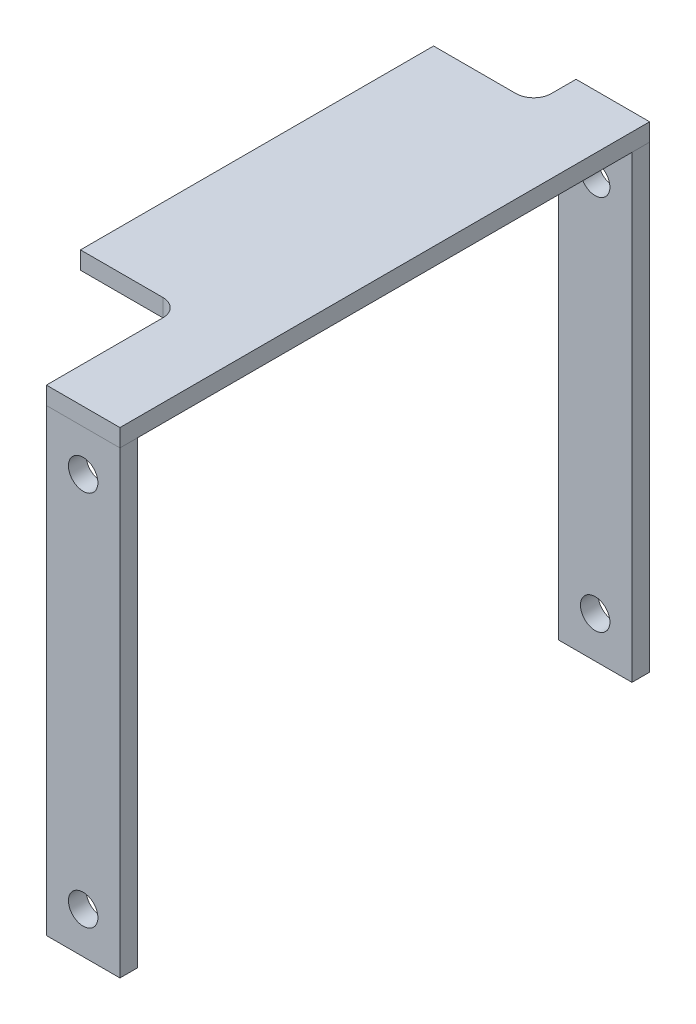
ISO-10303-21;
HEADER;
FILE_DESCRIPTION(('STEP AP214'),'2;1');
FILE_NAME('part.step','',(''),(''),'','','');
FILE_SCHEMA(('AUTOMOTIVE_DESIGN { 1 0 10303 214 1 1 1 1 }'));
ENDSEC;
DATA;
#1=APPLICATION_CONTEXT('core data for automotive mechanical design processes');
#2=APPLICATION_PROTOCOL_DEFINITION('international standard','automotive_design',2000,#1);
#3=PRODUCT_CONTEXT('',#1,'mechanical');
#4=PRODUCT('Part','Part','',(#3));
#5=PRODUCT_RELATED_PRODUCT_CATEGORY('part','',(#4));
#6=PRODUCT_DEFINITION_FORMATION('','',#4);
#7=PRODUCT_DEFINITION_CONTEXT('part definition',#1,'design');
#8=PRODUCT_DEFINITION('design','',#6,#7);
#9=PRODUCT_DEFINITION_SHAPE('','',#8);
#10=(LENGTH_UNIT() NAMED_UNIT(*) SI_UNIT(.MILLI.,.METRE.));
#11=(NAMED_UNIT(*) PLANE_ANGLE_UNIT() SI_UNIT($,.RADIAN.));
#12=(NAMED_UNIT(*) SI_UNIT($,.STERADIAN.) SOLID_ANGLE_UNIT());
#13=UNCERTAINTY_MEASURE_WITH_UNIT(LENGTH_MEASURE(1.E-05),#10,'distance_accuracy_value','');
#14=(GEOMETRIC_REPRESENTATION_CONTEXT(3) GLOBAL_UNCERTAINTY_ASSIGNED_CONTEXT((#13)) GLOBAL_UNIT_ASSIGNED_CONTEXT((#10,
#11,#12)) REPRESENTATION_CONTEXT('',''));
#15=CARTESIAN_POINT('',(0.,0.,0.));
#16=DIRECTION('',(0.,0.,1.));
#17=DIRECTION('',(1.,0.,0.));
#18=AXIS2_PLACEMENT_3D('',#15,#16,#17);
#19=CARTESIAN_POINT('',(0.,0.,0.));
#20=DIRECTION('',(1.,0.,0.));
#21=DIRECTION('',(0.,0.,-1.));
#22=AXIS2_PLACEMENT_3D('',#19,#20,#21);
#23=PLANE('',#22);
#24=DIRECTION('',(0.,0.,1.));
#25=VECTOR('',#24,1.);
#26=CARTESIAN_POINT('',(0.,78.,0.));
#27=LINE('',#26,#25);
#28=CARTESIAN_POINT('',(0.,78.,42.));
#29=VERTEX_POINT('',#28);
#30=CARTESIAN_POINT('',(0.,78.,45.));
#31=VERTEX_POINT('',#30);
#32=EDGE_CURVE('E11',#29,#31,#27,.T.);
#33=ORIENTED_EDGE('',*,*,#32,.F.);
#34=DIRECTION('',(0.,1.,0.));
#35=VECTOR('',#34,1.);
#36=CARTESIAN_POINT('',(0.,78.,42.));
#37=LINE('',#36,#35);
#38=CARTESIAN_POINT('',(0.,0.,42.));
#39=VERTEX_POINT('',#38);
#40=EDGE_CURVE('E243',#39,#29,#37,.T.);
#41=ORIENTED_EDGE('',*,*,#40,.F.);
#42=DIRECTION('',(0.,0.,-1.));
#43=VECTOR('',#42,1.);
#44=CARTESIAN_POINT('',(0.,0.,42.));
#45=LINE('',#44,#43);
#46=CARTESIAN_POINT('',(0.,0.,45.));
#47=VERTEX_POINT('',#46);
#48=EDGE_CURVE('E241',#47,#39,#45,.T.);
#49=ORIENTED_EDGE('',*,*,#48,.F.);
#50=DIRECTION('',(0.,-1.,0.));
#51=VECTOR('',#50,1.);
#52=CARTESIAN_POINT('',(0.,0.,45.));
#53=LINE('',#52,#51);
#54=EDGE_CURVE('E237',#31,#47,#53,.T.);
#55=ORIENTED_EDGE('',*,*,#54,.F.);
#56=EDGE_LOOP('',(#33,#41,#49,#55));
#57=FACE_BOUND('',#56,.T.);
#58=ADVANCED_FACE('F35',(#57),#23,.F.);
#59=CARTESIAN_POINT('',(12.5,0.,0.));
#60=DIRECTION('',(1.,0.,0.));
#61=DIRECTION('',(0.,0.,-1.));
#62=AXIS2_PLACEMENT_3D('',#59,#60,#61);
#63=PLANE('',#62);
#64=DIRECTION('',(0.,1.,0.));
#65=VECTOR('',#64,1.);
#66=CARTESIAN_POINT('',(12.5,0.,-45.));
#67=LINE('',#66,#65);
#68=CARTESIAN_POINT('',(12.5,0.,-45.));
#69=VERTEX_POINT('',#68);
#70=CARTESIAN_POINT('',(12.5,78.,-45.));
#71=VERTEX_POINT('',#70);
#72=EDGE_CURVE('E209',#69,#71,#67,.T.);
#73=ORIENTED_EDGE('',*,*,#72,.T.);
#74=DIRECTION('',(0.,0.,1.));
#75=VECTOR('',#74,1.);
#76=CARTESIAN_POINT('',(12.5,78.,0.));
#77=LINE('',#76,#75);
#78=CARTESIAN_POINT('',(12.5,78.,-42.));
#79=VERTEX_POINT('',#78);
#80=EDGE_CURVE('E45',#71,#79,#77,.T.);
#81=ORIENTED_EDGE('',*,*,#80,.T.);
#82=DIRECTION('',(0.,-1.,0.));
#83=VECTOR('',#82,1.);
#84=CARTESIAN_POINT('',(12.5,78.,-42.));
#85=LINE('',#84,#83);
#86=CARTESIAN_POINT('',(12.5,0.,-42.));
#87=VERTEX_POINT('',#86);
#88=EDGE_CURVE('E225',#79,#87,#85,.T.);
#89=ORIENTED_EDGE('',*,*,#88,.T.);
#90=DIRECTION('',(0.,0.,-1.));
#91=VECTOR('',#90,1.);
#92=CARTESIAN_POINT('',(12.5,0.,-42.));
#93=LINE('',#92,#91);
#94=EDGE_CURVE('E204',#87,#69,#93,.T.);
#95=ORIENTED_EDGE('',*,*,#94,.T.);
#96=EDGE_LOOP('',(#73,#81,#89,#95));
#97=FACE_BOUND('',#96,.T.);
#98=ADVANCED_FACE('F337',(#97),#63,.T.);
#99=DIRECTION('',(0.,1.,0.));
#100=VECTOR('',#99,1.);
#101=CARTESIAN_POINT('',(12.5,78.,42.));
#102=LINE('',#101,#100);
#103=CARTESIAN_POINT('',(12.5,0.,42.));
#104=VERTEX_POINT('',#103);
#105=CARTESIAN_POINT('',(12.5,78.,42.));
#106=VERTEX_POINT('',#105);
#107=EDGE_CURVE('E220',#104,#106,#102,.T.);
#108=ORIENTED_EDGE('',*,*,#107,.T.);
#109=CARTESIAN_POINT('',(12.5,78.,45.));
#110=VERTEX_POINT('',#109);
#111=EDGE_CURVE('E53',#106,#110,#77,.T.);
#112=ORIENTED_EDGE('',*,*,#111,.T.);
#113=DIRECTION('',(0.,-1.,0.));
#114=VECTOR('',#113,1.);
#115=CARTESIAN_POINT('',(12.5,0.,45.));
#116=LINE('',#115,#114);
#117=CARTESIAN_POINT('',(12.5,0.,45.));
#118=VERTEX_POINT('',#117);
#119=EDGE_CURVE('E214',#110,#118,#116,.T.);
#120=ORIENTED_EDGE('',*,*,#119,.T.);
#121=DIRECTION('',(0.,0.,-1.));
#122=VECTOR('',#121,1.);
#123=CARTESIAN_POINT('',(12.5,0.,42.));
#124=LINE('',#123,#122);
#125=EDGE_CURVE('E218',#118,#104,#124,.T.);
#126=ORIENTED_EDGE('',*,*,#125,.T.);
#127=EDGE_LOOP('',(#108,#112,#120,#126));
#128=FACE_BOUND('',#127,.T.);
#129=ADVANCED_FACE('F390',(#128),#63,.T.);
#130=DIRECTION('',(0.,0.,1.));
#131=VECTOR('',#130,1.);
#132=CARTESIAN_POINT('',(0.,78.,0.));
#133=LINE('',#132,#131);
#134=CARTESIAN_POINT('',(0.,78.,-45.));
#135=VERTEX_POINT('',#134);
#136=CARTESIAN_POINT('',(0.,78.,-42.));
#137=VERTEX_POINT('',#136);
#138=EDGE_CURVE('E295',#135,#137,#133,.T.);
#139=ORIENTED_EDGE('',*,*,#138,.F.);
#140=DIRECTION('',(0.,1.,0.));
#141=VECTOR('',#140,1.);
#142=CARTESIAN_POINT('',(0.,0.,-45.));
#143=LINE('',#142,#141);
#144=CARTESIAN_POINT('',(0.,0.,-45.));
#145=VERTEX_POINT('',#144);
#146=EDGE_CURVE('E231',#145,#135,#143,.T.);
#147=ORIENTED_EDGE('',*,*,#146,.F.);
#148=DIRECTION('',(0.,0.,-1.));
#149=VECTOR('',#148,1.);
#150=CARTESIAN_POINT('',(0.,0.,-42.));
#151=LINE('',#150,#149);
#152=CARTESIAN_POINT('',(0.,0.,-42.));
#153=VERTEX_POINT('',#152);
#154=EDGE_CURVE('E203',#153,#145,#151,.T.);
#155=ORIENTED_EDGE('',*,*,#154,.F.);
#156=DIRECTION('',(0.,-1.,0.));
#157=VECTOR('',#156,1.);
#158=CARTESIAN_POINT('',(0.,78.,-42.));
#159=LINE('',#158,#157);
#160=EDGE_CURVE('E208',#137,#153,#159,.T.);
#161=ORIENTED_EDGE('',*,*,#160,.F.);
#162=EDGE_LOOP('',(#139,#147,#155,#161));
#163=FACE_BOUND('',#162,.T.);
#164=ADVANCED_FACE('F326',(#163),#23,.F.);
#165=CARTESIAN_POINT('',(12.5,0.,45.));
#166=DIRECTION('',(0.,0.,-1.));
#167=DIRECTION('',(-1.,0.,0.));
#168=AXIS2_PLACEMENT_3D('',#165,#166,#167);
#169=PLANE('',#168);
#170=CARTESIAN_POINT('',(6.25,7.,45.));
#171=DIRECTION('',(0.,0.,-1.));
#172=DIRECTION('',(-1.,0.,0.));
#173=AXIS2_PLACEMENT_3D('',#170,#171,#172);
#174=CIRCLE('',#173,2.5);
#175=CARTESIAN_POINT('',(8.75,7.,45.));
#176=VERTEX_POINT('',#175);
#177=EDGE_CURVE('E193',#176,#176,#174,.T.);
#178=ORIENTED_EDGE('',*,*,#177,.T.);
#179=EDGE_LOOP('',(#178));
#180=FACE_BOUND('',#179,.T.);
#181=CARTESIAN_POINT('',(6.25,71.,45.));
#182=DIRECTION('',(0.,0.,-1.));
#183=DIRECTION('',(-1.,0.,0.));
#184=AXIS2_PLACEMENT_3D('',#181,#182,#183);
#185=CIRCLE('',#184,2.5);
#186=CARTESIAN_POINT('',(8.75,71.,45.));
#187=VERTEX_POINT('',#186);
#188=EDGE_CURVE('E200',#187,#187,#185,.T.);
#189=ORIENTED_EDGE('',*,*,#188,.T.);
#190=EDGE_LOOP('',(#189));
#191=FACE_BOUND('',#190,.T.);
#192=DIRECTION('',(1.,0.,0.));
#193=VECTOR('',#192,1.);
#194=CARTESIAN_POINT('',(12.5,78.,45.));
#195=LINE('',#194,#193);
#196=EDGE_CURVE('E298',#31,#110,#195,.T.);
#197=ORIENTED_EDGE('',*,*,#196,.F.);
#198=ORIENTED_EDGE('',*,*,#54,.T.);
#199=DIRECTION('',(-1.,0.,0.));
#200=VECTOR('',#199,1.);
#201=CARTESIAN_POINT('',(12.5,0.,45.));
#202=LINE('',#201,#200);
#203=EDGE_CURVE('E262',#118,#47,#202,.T.);
#204=ORIENTED_EDGE('',*,*,#203,.F.);
#205=ORIENTED_EDGE('',*,*,#119,.F.);
#206=EDGE_LOOP('',(#197,#198,#204,#205));
#207=FACE_BOUND('',#206,.T.);
#208=ADVANCED_FACE('F375',(#180,#191,#207),#169,.F.);
#209=CARTESIAN_POINT('',(12.5,0.,-45.));
#210=DIRECTION('',(0.,0.,1.));
#211=DIRECTION('',(0.,-1.,0.));
#212=AXIS2_PLACEMENT_3D('',#209,#210,#211);
#213=PLANE('',#212);
#214=CARTESIAN_POINT('',(6.25,7.,-45.));
#215=DIRECTION('',(0.,0.,1.));
#216=DIRECTION('',(1.,0.,0.));
#217=AXIS2_PLACEMENT_3D('',#214,#215,#216);
#218=CIRCLE('',#217,2.5);
#219=CARTESIAN_POINT('',(8.75,7.,-45.));
#220=VERTEX_POINT('',#219);
#221=EDGE_CURVE('E182',#220,#220,#218,.T.);
#222=ORIENTED_EDGE('',*,*,#221,.T.);
#223=EDGE_LOOP('',(#222));
#224=FACE_BOUND('',#223,.T.);
#225=CARTESIAN_POINT('',(6.25,71.,-45.));
#226=DIRECTION('',(0.,0.,1.));
#227=DIRECTION('',(1.,0.,0.));
#228=AXIS2_PLACEMENT_3D('',#225,#226,#227);
#229=CIRCLE('',#228,2.5);
#230=CARTESIAN_POINT('',(8.75,71.,-45.));
#231=VERTEX_POINT('',#230);
#232=EDGE_CURVE('E184',#231,#231,#229,.T.);
#233=ORIENTED_EDGE('',*,*,#232,.T.);
#234=EDGE_LOOP('',(#233));
#235=FACE_BOUND('',#234,.T.);
#236=DIRECTION('',(-1.,0.,0.));
#237=VECTOR('',#236,1.);
#238=CARTESIAN_POINT('',(12.5,78.,-45.));
#239=LINE('',#238,#237);
#240=EDGE_CURVE('E39',#71,#135,#239,.T.);
#241=ORIENTED_EDGE('',*,*,#240,.F.);
#242=ORIENTED_EDGE('',*,*,#72,.F.);
#243=DIRECTION('',(-1.,0.,0.));
#244=VECTOR('',#243,1.);
#245=CARTESIAN_POINT('',(12.5,0.,-45.));
#246=LINE('',#245,#244);
#247=EDGE_CURVE('E271',#69,#145,#246,.T.);
#248=ORIENTED_EDGE('',*,*,#247,.T.);
#249=ORIENTED_EDGE('',*,*,#146,.T.);
#250=EDGE_LOOP('',(#241,#242,#248,#249));
#251=FACE_BOUND('',#250,.T.);
#252=ADVANCED_FACE('F322',(#224,#235,#251),#213,.F.);
#253=DIRECTION('',(0.,0.,-1.));
#254=VECTOR('',#253,1.);
#255=CARTESIAN_POINT('',(0.,78.,-42.));
#256=LINE('',#255,#254);
#257=CARTESIAN_POINT('',(0.,78.,25.2059971529592));
#258=VERTEX_POINT('',#257);
#259=EDGE_CURVE('E247',#29,#258,#256,.T.);
#260=ORIENTED_EDGE('',*,*,#259,.F.);
#261=ORIENTED_EDGE('',*,*,#32,.T.);
#262=CARTESIAN_POINT('',(0.,81.,45.));
#263=VERTEX_POINT('',#262);
#264=EDGE_CURVE('E238',#263,#31,#53,.T.);
#265=ORIENTED_EDGE('',*,*,#264,.F.);
#266=DIRECTION('',(0.,0.,1.));
#267=VECTOR('',#266,1.);
#268=CARTESIAN_POINT('',(0.,81.,45.));
#269=LINE('',#268,#267);
#270=CARTESIAN_POINT('',(0.,81.,25.2059971529593));
#271=VERTEX_POINT('',#270);
#272=EDGE_CURVE('E234',#271,#263,#269,.T.);
#273=ORIENTED_EDGE('',*,*,#272,.F.);
#274=DIRECTION('',(0.,1.,0.));
#275=VECTOR('',#274,1.);
#276=CARTESIAN_POINT('',(0.,0.,25.2059971529592));
#277=LINE('',#276,#275);
#278=EDGE_CURVE('E281',#271,#258,#277,.F.);
#279=ORIENTED_EDGE('',*,*,#278,.T.);
#280=EDGE_LOOP('',(#260,#261,#265,#273,#279));
#281=FACE_BOUND('',#280,.T.);
#282=ADVANCED_FACE('F356',(#281),#23,.F.);
#283=CARTESIAN_POINT('',(12.5,0.,-42.));
#284=DIRECTION('',(0.,1.,0.));
#285=DIRECTION('',(0.,0.,1.));
#286=AXIS2_PLACEMENT_3D('',#283,#284,#285);
#287=PLANE('',#286);
#288=ORIENTED_EDGE('',*,*,#154,.T.);
#289=ORIENTED_EDGE('',*,*,#247,.F.);
#290=ORIENTED_EDGE('',*,*,#94,.F.);
#291=DIRECTION('',(-1.,0.,0.));
#292=VECTOR('',#291,1.);
#293=CARTESIAN_POINT('',(12.5,0.,-42.));
#294=LINE('',#293,#292);
#295=EDGE_CURVE('E227',#87,#153,#294,.T.);
#296=ORIENTED_EDGE('',*,*,#295,.T.);
#297=EDGE_LOOP('',(#288,#289,#290,#296));
#298=FACE_BOUND('',#297,.T.);
#299=ADVANCED_FACE('F335',(#298),#287,.F.);
#300=CARTESIAN_POINT('',(12.5,81.,-45.));
#301=VERTEX_POINT('',#300);
#302=EDGE_CURVE('E207',#71,#301,#67,.T.);
#303=ORIENTED_EDGE('',*,*,#302,.F.);
#304=ORIENTED_EDGE('',*,*,#240,.T.);
#305=CARTESIAN_POINT('',(0.,81.,-45.));
#306=VERTEX_POINT('',#305);
#307=EDGE_CURVE('E230',#135,#306,#143,.T.);
#308=ORIENTED_EDGE('',*,*,#307,.T.);
#309=DIRECTION('',(-1.,0.,0.));
#310=VECTOR('',#309,1.);
#311=CARTESIAN_POINT('',(12.5,81.,-45.));
#312=LINE('',#311,#310);
#313=EDGE_CURVE('E268',#301,#306,#312,.T.);
#314=ORIENTED_EDGE('',*,*,#313,.F.);
#315=EDGE_LOOP('',(#303,#304,#308,#314));
#316=FACE_BOUND('',#315,.T.);
#317=ADVANCED_FACE('F314',(#316),#213,.F.);
#318=CARTESIAN_POINT('',(12.5,81.,45.));
#319=DIRECTION('',(0.,-1.,0.));
#320=DIRECTION('',(0.,0.,-1.));
#321=AXIS2_PLACEMENT_3D('',#318,#319,#320);
#322=PLANE('',#321);
#323=CARTESIAN_POINT('',(0.,81.,-40.7940028470407));
#324=VERTEX_POINT('',#323);
#325=EDGE_CURVE('E235',#306,#324,#269,.T.);
#326=ORIENTED_EDGE('',*,*,#325,.T.);
#327=CARTESIAN_POINT('',(-3.,81.,-40.7940028470407));
#328=DIRECTION('',(0.,-1.,0.));
#329=DIRECTION('',(0.,0.,-1.));
#330=AXIS2_PLACEMENT_3D('',#327,#328,#329);
#331=CIRCLE('',#330,3.);
#332=CARTESIAN_POINT('',(-3.,81.,-37.7940028470407));
#333=VERTEX_POINT('',#332);
#334=EDGE_CURVE('E158',#324,#333,#331,.T.);
#335=ORIENTED_EDGE('',*,*,#334,.T.);
#336=DIRECTION('',(-1.,0.,0.));
#337=VECTOR('',#336,1.);
#338=CARTESIAN_POINT('',(0.,81.,-37.7940028470407));
#339=LINE('',#338,#337);
#340=CARTESIAN_POINT('',(-17.,81.,-37.7940028470407));
#341=VERTEX_POINT('',#340);
#342=EDGE_CURVE('E150',#333,#341,#339,.T.);
#343=ORIENTED_EDGE('',*,*,#342,.T.);
#344=DIRECTION('',(0.,0.,1.));
#345=VECTOR('',#344,1.);
#346=CARTESIAN_POINT('',(-17.,81.,-37.7940028470407));
#347=LINE('',#346,#345);
#348=CARTESIAN_POINT('',(-17.,81.,22.2059971529593));
#349=VERTEX_POINT('',#348);
#350=EDGE_CURVE('E156',#341,#349,#347,.T.);
#351=ORIENTED_EDGE('',*,*,#350,.T.);
#352=DIRECTION('',(1.,0.,0.));
#353=VECTOR('',#352,1.);
#354=CARTESIAN_POINT('',(-17.,81.,22.2059971529593));
#355=LINE('',#354,#353);
#356=CARTESIAN_POINT('',(-3.,81.,22.2059971529593));
#357=VERTEX_POINT('',#356);
#358=EDGE_CURVE('E171',#349,#357,#355,.T.);
#359=ORIENTED_EDGE('',*,*,#358,.T.);
#360=CARTESIAN_POINT('',(-3.,81.,25.2059971529593));
#361=DIRECTION('',(0.,-1.,0.));
#362=DIRECTION('',(0.,0.,-1.));
#363=AXIS2_PLACEMENT_3D('',#360,#361,#362);
#364=CIRCLE('',#363,3.);
#365=EDGE_CURVE('E288',#357,#271,#364,.T.);
#366=ORIENTED_EDGE('',*,*,#365,.T.);
#367=ORIENTED_EDGE('',*,*,#272,.T.);
#368=DIRECTION('',(-1.,0.,0.));
#369=VECTOR('',#368,1.);
#370=CARTESIAN_POINT('',(12.5,81.,45.));
#371=LINE('',#370,#369);
#372=CARTESIAN_POINT('',(12.5,81.,45.));
#373=VERTEX_POINT('',#372);
#374=EDGE_CURVE('E265',#373,#263,#371,.T.);
#375=ORIENTED_EDGE('',*,*,#374,.F.);
#376=DIRECTION('',(0.,0.,1.));
#377=VECTOR('',#376,1.);
#378=CARTESIAN_POINT('',(12.5,81.,45.));
#379=LINE('',#378,#377);
#380=EDGE_CURVE('E212',#301,#373,#379,.T.);
#381=ORIENTED_EDGE('',*,*,#380,.F.);
#382=ORIENTED_EDGE('',*,*,#313,.T.);
#383=EDGE_LOOP('',(#326,#335,#343,#351,#359,#366,#367,#375,#381,#382));
#384=FACE_BOUND('',#383,.T.);
#385=ADVANCED_FACE('F153',(#384),#322,.F.);
#386=ORIENTED_EDGE('',*,*,#264,.T.);
#387=ORIENTED_EDGE('',*,*,#196,.T.);
#388=EDGE_CURVE('E215',#373,#110,#116,.T.);
#389=ORIENTED_EDGE('',*,*,#388,.F.);
#390=ORIENTED_EDGE('',*,*,#374,.T.);
#391=EDGE_LOOP('',(#386,#387,#389,#390));
#392=FACE_BOUND('',#391,.T.);
#393=ADVANCED_FACE('F370',(#392),#169,.F.);
#394=CARTESIAN_POINT('',(12.5,0.,42.));
#395=DIRECTION('',(0.,1.,0.));
#396=DIRECTION('',(0.,0.,1.));
#397=AXIS2_PLACEMENT_3D('',#394,#395,#396);
#398=PLANE('',#397);
#399=ORIENTED_EDGE('',*,*,#48,.T.);
#400=DIRECTION('',(-1.,0.,0.));
#401=VECTOR('',#400,1.);
#402=CARTESIAN_POINT('',(12.5,0.,42.));
#403=LINE('',#402,#401);
#404=EDGE_CURVE('E259',#104,#39,#403,.T.);
#405=ORIENTED_EDGE('',*,*,#404,.F.);
#406=ORIENTED_EDGE('',*,*,#125,.F.);
#407=ORIENTED_EDGE('',*,*,#203,.T.);
#408=EDGE_LOOP('',(#399,#405,#406,#407));
#409=FACE_BOUND('',#408,.T.);
#410=ADVANCED_FACE('F373',(#409),#398,.F.);
#411=CARTESIAN_POINT('',(12.5,78.,42.));
#412=DIRECTION('',(0.,0.,1.));
#413=DIRECTION('',(0.,-1.,0.));
#414=AXIS2_PLACEMENT_3D('',#411,#412,#413);
#415=PLANE('',#414);
#416=CARTESIAN_POINT('',(6.25,71.,42.));
#417=DIRECTION('',(0.,0.,1.));
#418=DIRECTION('',(0.,-1.,0.));
#419=AXIS2_PLACEMENT_3D('',#416,#417,#418);
#420=CIRCLE('',#419,2.5);
#421=CARTESIAN_POINT('',(8.75,71.,42.));
#422=VERTEX_POINT('',#421);
#423=EDGE_CURVE('E197',#422,#422,#420,.T.);
#424=ORIENTED_EDGE('',*,*,#423,.T.);
#425=EDGE_LOOP('',(#424));
#426=FACE_BOUND('',#425,.T.);
#427=CARTESIAN_POINT('',(6.25,7.,42.));
#428=DIRECTION('',(0.,0.,1.));
#429=DIRECTION('',(0.,-1.,0.));
#430=AXIS2_PLACEMENT_3D('',#427,#428,#429);
#431=CIRCLE('',#430,2.5);
#432=CARTESIAN_POINT('',(8.75,7.,42.));
#433=VERTEX_POINT('',#432);
#434=EDGE_CURVE('E190',#433,#433,#431,.T.);
#435=ORIENTED_EDGE('',*,*,#434,.T.);
#436=EDGE_LOOP('',(#435));
#437=FACE_BOUND('',#436,.T.);
#438=ORIENTED_EDGE('',*,*,#40,.T.);
#439=DIRECTION('',(-1.,0.,0.));
#440=VECTOR('',#439,1.);
#441=CARTESIAN_POINT('',(12.5,78.,42.));
#442=LINE('',#441,#440);
#443=EDGE_CURVE('E256',#106,#29,#442,.T.);
#444=ORIENTED_EDGE('',*,*,#443,.F.);
#445=ORIENTED_EDGE('',*,*,#107,.F.);
#446=ORIENTED_EDGE('',*,*,#404,.T.);
#447=EDGE_LOOP('',(#438,#444,#445,#446));
#448=FACE_BOUND('',#447,.T.);
#449=ADVANCED_FACE('F362',(#426,#437,#448),#415,.F.);
#450=CARTESIAN_POINT('',(12.5,78.,-42.));
#451=DIRECTION('',(0.,1.,0.));
#452=DIRECTION('',(0.,0.,1.));
#453=AXIS2_PLACEMENT_3D('',#450,#451,#452);
#454=PLANE('',#453);
#455=ORIENTED_EDGE('',*,*,#259,.T.);
#456=CARTESIAN_POINT('',(-3.,78.,25.2059971529593));
#457=DIRECTION('',(0.,1.,0.));
#458=DIRECTION('',(0.,0.,1.));
#459=AXIS2_PLACEMENT_3D('',#456,#457,#458);
#460=CIRCLE('',#459,3.);
#461=CARTESIAN_POINT('',(-3.,78.,22.2059971529593));
#462=VERTEX_POINT('',#461);
#463=EDGE_CURVE('E290',#258,#462,#460,.T.);
#464=ORIENTED_EDGE('',*,*,#463,.T.);
#465=DIRECTION('',(-1.,0.,0.));
#466=VECTOR('',#465,1.);
#467=CARTESIAN_POINT('',(-17.,78.,22.2059971529593));
#468=LINE('',#467,#466);
#469=CARTESIAN_POINT('',(-17.,78.,22.2059971529593));
#470=VERTEX_POINT('',#469);
#471=EDGE_CURVE('E183',#462,#470,#468,.T.);
#472=ORIENTED_EDGE('',*,*,#471,.T.);
#473=DIRECTION('',(0.,0.,-1.));
#474=VECTOR('',#473,1.);
#475=CARTESIAN_POINT('',(-17.,78.,-37.7940028470407));
#476=LINE('',#475,#474);
#477=CARTESIAN_POINT('',(-17.,78.,-37.7940028470407));
#478=VERTEX_POINT('',#477);
#479=EDGE_CURVE('E179',#470,#478,#476,.T.);
#480=ORIENTED_EDGE('',*,*,#479,.T.);
#481=DIRECTION('',(1.,0.,0.));
#482=VECTOR('',#481,1.);
#483=CARTESIAN_POINT('',(0.,78.,-37.7940028470407));
#484=LINE('',#483,#482);
#485=CARTESIAN_POINT('',(-3.,78.,-37.7940028470407));
#486=VERTEX_POINT('',#485);
#487=EDGE_CURVE('E167',#478,#486,#484,.T.);
#488=ORIENTED_EDGE('',*,*,#487,.T.);
#489=CARTESIAN_POINT('',(-3.,78.,-40.7940028470407));
#490=DIRECTION('',(0.,1.,0.));
#491=DIRECTION('',(0.,0.,1.));
#492=AXIS2_PLACEMENT_3D('',#489,#490,#491);
#493=CIRCLE('',#492,3.);
#494=CARTESIAN_POINT('',(0.,78.,-40.7940028470407));
#495=VERTEX_POINT('',#494);
#496=EDGE_CURVE('E293',#486,#495,#493,.T.);
#497=ORIENTED_EDGE('',*,*,#496,.T.);
#498=EDGE_CURVE('E246',#495,#137,#256,.T.);
#499=ORIENTED_EDGE('',*,*,#498,.T.);
#500=DIRECTION('',(-1.,0.,0.));
#501=VECTOR('',#500,1.);
#502=CARTESIAN_POINT('',(12.5,78.,-42.));
#503=LINE('',#502,#501);
#504=EDGE_CURVE('E253',#79,#137,#503,.T.);
#505=ORIENTED_EDGE('',*,*,#504,.F.);
#506=DIRECTION('',(0.,0.,-1.));
#507=VECTOR('',#506,1.);
#508=CARTESIAN_POINT('',(12.5,78.,-42.));
#509=LINE('',#508,#507);
#510=EDGE_CURVE('E222',#106,#79,#509,.T.);
#511=ORIENTED_EDGE('',*,*,#510,.F.);
#512=ORIENTED_EDGE('',*,*,#443,.T.);
#513=EDGE_LOOP('',(#455,#464,#472,#480,#488,#497,#499,#505,#511,#512));
#514=FACE_BOUND('',#513,.T.);
#515=ADVANCED_FACE('F343',(#514),#454,.F.);
#516=CARTESIAN_POINT('',(12.5,78.,-42.));
#517=DIRECTION('',(0.,0.,-1.));
#518=DIRECTION('',(-1.,0.,0.));
#519=AXIS2_PLACEMENT_3D('',#516,#517,#518);
#520=PLANE('',#519);
#521=CARTESIAN_POINT('',(6.25,71.,-42.));
#522=DIRECTION('',(0.,0.,-1.));
#523=DIRECTION('',(-1.,0.,0.));
#524=AXIS2_PLACEMENT_3D('',#521,#522,#523);
#525=CIRCLE('',#524,2.5);
#526=CARTESIAN_POINT('',(8.75,71.,-42.));
#527=VERTEX_POINT('',#526);
#528=EDGE_CURVE('E196',#527,#527,#525,.T.);
#529=ORIENTED_EDGE('',*,*,#528,.T.);
#530=EDGE_LOOP('',(#529));
#531=FACE_BOUND('',#530,.T.);
#532=CARTESIAN_POINT('',(6.25,7.,-42.));
#533=DIRECTION('',(0.,0.,-1.));
#534=DIRECTION('',(-1.,0.,0.));
#535=AXIS2_PLACEMENT_3D('',#532,#533,#534);
#536=CIRCLE('',#535,2.5);
#537=CARTESIAN_POINT('',(8.75,7.,-42.));
#538=VERTEX_POINT('',#537);
#539=EDGE_CURVE('E187',#538,#538,#536,.T.);
#540=ORIENTED_EDGE('',*,*,#539,.T.);
#541=EDGE_LOOP('',(#540));
#542=FACE_BOUND('',#541,.T.);
#543=ORIENTED_EDGE('',*,*,#160,.T.);
#544=ORIENTED_EDGE('',*,*,#295,.F.);
#545=ORIENTED_EDGE('',*,*,#88,.F.);
#546=ORIENTED_EDGE('',*,*,#504,.T.);
#547=EDGE_LOOP('',(#543,#544,#545,#546));
#548=FACE_BOUND('',#547,.T.);
#549=ADVANCED_FACE('F330',(#531,#542,#548),#520,.F.);
#550=ORIENTED_EDGE('',*,*,#80,.F.);
#551=ORIENTED_EDGE('',*,*,#302,.T.);
#552=ORIENTED_EDGE('',*,*,#380,.T.);
#553=ORIENTED_EDGE('',*,*,#388,.T.);
#554=ORIENTED_EDGE('',*,*,#111,.F.);
#555=ORIENTED_EDGE('',*,*,#510,.T.);
#556=EDGE_LOOP('',(#550,#551,#552,#553,#554,#555));
#557=FACE_BOUND('',#556,.T.);
#558=ADVANCED_FACE('F341',(#557),#63,.T.);
#559=ORIENTED_EDGE('',*,*,#307,.F.);
#560=ORIENTED_EDGE('',*,*,#138,.T.);
#561=ORIENTED_EDGE('',*,*,#498,.F.);
#562=DIRECTION('',(0.,1.,0.));
#563=VECTOR('',#562,1.);
#564=CARTESIAN_POINT('',(0.,0.,-40.7940028470407));
#565=LINE('',#564,#563);
#566=EDGE_CURVE('E283',#495,#324,#565,.T.);
#567=ORIENTED_EDGE('',*,*,#566,.T.);
#568=ORIENTED_EDGE('',*,*,#325,.F.);
#569=EDGE_LOOP('',(#559,#560,#561,#567,#568));
#570=FACE_BOUND('',#569,.T.);
#571=ADVANCED_FACE('F319',(#570),#23,.F.);
#572=CARTESIAN_POINT('',(6.25,7.,-45.));
#573=DIRECTION('',(0.,0.,1.));
#574=DIRECTION('',(1.,0.,0.));
#575=AXIS2_PLACEMENT_3D('',#572,#573,#574);
#576=CYLINDRICAL_SURFACE('',#575,2.5);
#577=CARTESIAN_POINT('',(8.75,7.,-45.));
#578=CARTESIAN_POINT('',(8.75,7.,-44.96875));
#579=CARTESIAN_POINT('',(8.75,7.,-44.9375));
#580=CARTESIAN_POINT('',(8.75,7.,-44.875));
#581=CARTESIAN_POINT('',(8.75,7.,-44.84375));
#582=CARTESIAN_POINT('',(8.75,7.,-44.78125));
#583=CARTESIAN_POINT('',(8.75,7.,-44.75));
#584=CARTESIAN_POINT('',(8.75,7.,-44.6875));
#585=CARTESIAN_POINT('',(8.75,7.,-44.65625));
#586=CARTESIAN_POINT('',(8.75,7.,-44.59375));
#587=CARTESIAN_POINT('',(8.75,7.,-44.5625));
#588=CARTESIAN_POINT('',(8.75,7.,-44.5));
#589=CARTESIAN_POINT('',(8.75,7.,-44.46875));
#590=CARTESIAN_POINT('',(8.75,7.,-44.40625));
#591=CARTESIAN_POINT('',(8.75,7.,-44.375));
#592=CARTESIAN_POINT('',(8.75,7.,-44.3125));
#593=CARTESIAN_POINT('',(8.75,7.,-44.28125));
#594=CARTESIAN_POINT('',(8.75,7.,-44.21875));
#595=CARTESIAN_POINT('',(8.75,7.,-44.1875));
#596=CARTESIAN_POINT('',(8.75,7.,-44.125));
#597=CARTESIAN_POINT('',(8.75,7.,-44.09375));
#598=CARTESIAN_POINT('',(8.75,7.,-44.03125));
#599=CARTESIAN_POINT('',(8.75,7.,-44.));
#600=CARTESIAN_POINT('',(8.75,7.,-43.9375));
#601=CARTESIAN_POINT('',(8.75,7.,-43.90625));
#602=CARTESIAN_POINT('',(8.75,7.,-43.84375));
#603=CARTESIAN_POINT('',(8.75,7.,-43.8125));
#604=CARTESIAN_POINT('',(8.75,7.,-43.75));
#605=CARTESIAN_POINT('',(8.75,7.,-43.71875));
#606=CARTESIAN_POINT('',(8.75,7.,-43.65625));
#607=CARTESIAN_POINT('',(8.75,7.,-43.625));
#608=CARTESIAN_POINT('',(8.75,7.,-43.5625));
#609=CARTESIAN_POINT('',(8.75,7.,-43.53125));
#610=CARTESIAN_POINT('',(8.75,7.,-43.46875));
#611=CARTESIAN_POINT('',(8.75,7.,-43.4375));
#612=CARTESIAN_POINT('',(8.75,7.,-43.375));
#613=CARTESIAN_POINT('',(8.75,7.,-43.34375));
#614=CARTESIAN_POINT('',(8.75,7.,-43.28125));
#615=CARTESIAN_POINT('',(8.75,7.,-43.25));
#616=CARTESIAN_POINT('',(8.75,7.,-43.1875));
#617=CARTESIAN_POINT('',(8.75,7.,-43.15625));
#618=CARTESIAN_POINT('',(8.75,7.,-43.09375));
#619=CARTESIAN_POINT('',(8.75,7.,-43.0625));
#620=CARTESIAN_POINT('',(8.75,7.,-43.));
#621=CARTESIAN_POINT('',(8.75,7.,-42.96875));
#622=CARTESIAN_POINT('',(8.75,7.,-42.90625));
#623=CARTESIAN_POINT('',(8.75,7.,-42.875));
#624=CARTESIAN_POINT('',(8.75,7.,-42.8125));
#625=CARTESIAN_POINT('',(8.75,7.,-42.78125));
#626=CARTESIAN_POINT('',(8.75,7.,-42.71875));
#627=CARTESIAN_POINT('',(8.75,7.,-42.6875));
#628=CARTESIAN_POINT('',(8.75,7.,-42.625));
#629=CARTESIAN_POINT('',(8.75,7.,-42.59375));
#630=CARTESIAN_POINT('',(8.75,7.,-42.53125));
#631=CARTESIAN_POINT('',(8.75,7.,-42.5));
#632=CARTESIAN_POINT('',(8.75,7.,-42.4375));
#633=CARTESIAN_POINT('',(8.75,7.,-42.40625));
#634=CARTESIAN_POINT('',(8.75,7.,-42.34375));
#635=CARTESIAN_POINT('',(8.75,7.,-42.3125));
#636=CARTESIAN_POINT('',(8.75,7.,-42.25));
#637=CARTESIAN_POINT('',(8.75,7.,-42.21875));
#638=CARTESIAN_POINT('',(8.75,7.,-42.15625));
#639=CARTESIAN_POINT('',(8.75,7.,-42.125));
#640=CARTESIAN_POINT('',(8.75,7.,-42.0625));
#641=CARTESIAN_POINT('',(8.75,7.,-42.03125));
#642=CARTESIAN_POINT('',(8.75,7.,-42.));
#643=B_SPLINE_CURVE_WITH_KNOTS('',3,(#577,#578,#579,#580,#581,#582,#583,#584,#585,#586,#587,
#588,#589,#590,#591,#592,#593,#594,#595,#596,#597,#598,#599,#600,#601,#602,#603,#604,#605,#606,
#607,#608,#609,#610,#611,#612,#613,#614,#615,#616,#617,#618,#619,#620,#621,#622,#623,#624,#625,
#626,#627,#628,#629,#630,#631,#632,#633,#634,#635,#636,#637,#638,#639,#640,#641,#642),
.UNSPECIFIED.,.F.,.F.,(4,2,2,2,2,2,2,2,2,2,2,2,2,2,2,2,2,2,2,2,2,2,2,2,2,2,2,2,2,2,2,2,4),(0.,
0.0937499999999966,0.1875,0.281249999999997,0.375,0.468749999999997,0.5625,0.656249999999997,
0.750000000000001,0.843749999999997,0.937500000000001,1.03125,1.125,1.21875,1.3125,1.40625,1.5,
1.59375,1.6875,1.78125000000001,1.875,1.96875000000001,2.0625,2.15625000000001,2.25,
2.34375000000001,2.4375,2.53125000000001,2.625,2.71875000000001,2.81250000000001,
2.90625000000001,3.00000000000001),.UNSPECIFIED.);
#644=EDGE_CURVE('BSEAM395',#220,#538,#643,.T.);
#645=ORIENTED_EDGE('',*,*,#221,.F.);
#646=ORIENTED_EDGE('',*,*,#539,.F.);
#647=ORIENTED_EDGE('',*,*,#644,.T.);
#648=ORIENTED_EDGE('',*,*,#644,.F.);
#649=EDGE_LOOP('',(#645,#647,#646,#648));
#650=FACE_BOUND('',#649,.T.);
#651=ADVANCED_FACE('F395',(#650),#576,.F.);
#652=CARTESIAN_POINT('',(6.25,71.,-45.));
#653=DIRECTION('',(0.,0.,1.));
#654=DIRECTION('',(1.,0.,0.));
#655=AXIS2_PLACEMENT_3D('',#652,#653,#654);
#656=CYLINDRICAL_SURFACE('',#655,2.5);
#657=CARTESIAN_POINT('',(8.75,71.,-45.));
#658=CARTESIAN_POINT('',(8.75,71.,-44.96875));
#659=CARTESIAN_POINT('',(8.75,71.,-44.9375));
#660=CARTESIAN_POINT('',(8.75,71.,-44.875));
#661=CARTESIAN_POINT('',(8.75,71.,-44.84375));
#662=CARTESIAN_POINT('',(8.75,71.,-44.78125));
#663=CARTESIAN_POINT('',(8.75,71.,-44.75));
#664=CARTESIAN_POINT('',(8.75,71.,-44.6875));
#665=CARTESIAN_POINT('',(8.75,71.,-44.65625));
#666=CARTESIAN_POINT('',(8.75,71.,-44.59375));
#667=CARTESIAN_POINT('',(8.75,71.,-44.5625));
#668=CARTESIAN_POINT('',(8.75,71.,-44.5));
#669=CARTESIAN_POINT('',(8.75,71.,-44.46875));
#670=CARTESIAN_POINT('',(8.75,71.,-44.40625));
#671=CARTESIAN_POINT('',(8.75,71.,-44.375));
#672=CARTESIAN_POINT('',(8.75,71.,-44.3125));
#673=CARTESIAN_POINT('',(8.75,71.,-44.28125));
#674=CARTESIAN_POINT('',(8.75,71.,-44.21875));
#675=CARTESIAN_POINT('',(8.75,71.,-44.1875));
#676=CARTESIAN_POINT('',(8.75,71.,-44.125));
#677=CARTESIAN_POINT('',(8.75,71.,-44.09375));
#678=CARTESIAN_POINT('',(8.75,71.,-44.03125));
#679=CARTESIAN_POINT('',(8.75,71.,-44.));
#680=CARTESIAN_POINT('',(8.75,71.,-43.9375));
#681=CARTESIAN_POINT('',(8.75,71.,-43.90625));
#682=CARTESIAN_POINT('',(8.75,71.,-43.84375));
#683=CARTESIAN_POINT('',(8.75,71.,-43.8125));
#684=CARTESIAN_POINT('',(8.75,71.,-43.75));
#685=CARTESIAN_POINT('',(8.75,71.,-43.71875));
#686=CARTESIAN_POINT('',(8.75,71.,-43.65625));
#687=CARTESIAN_POINT('',(8.75,71.,-43.625));
#688=CARTESIAN_POINT('',(8.75,71.,-43.5625));
#689=CARTESIAN_POINT('',(8.75,71.,-43.53125));
#690=CARTESIAN_POINT('',(8.75,71.,-43.46875));
#691=CARTESIAN_POINT('',(8.75,71.,-43.4375));
#692=CARTESIAN_POINT('',(8.75,71.,-43.375));
#693=CARTESIAN_POINT('',(8.75,71.,-43.34375));
#694=CARTESIAN_POINT('',(8.75,71.,-43.28125));
#695=CARTESIAN_POINT('',(8.75,71.,-43.25));
#696=CARTESIAN_POINT('',(8.75,71.,-43.1875));
#697=CARTESIAN_POINT('',(8.75,71.,-43.15625));
#698=CARTESIAN_POINT('',(8.75,71.,-43.09375));
#699=CARTESIAN_POINT('',(8.75,71.,-43.0625));
#700=CARTESIAN_POINT('',(8.75,71.,-43.));
#701=CARTESIAN_POINT('',(8.75,71.,-42.96875));
#702=CARTESIAN_POINT('',(8.75,71.,-42.90625));
#703=CARTESIAN_POINT('',(8.75,71.,-42.875));
#704=CARTESIAN_POINT('',(8.75,71.,-42.8125));
#705=CARTESIAN_POINT('',(8.75,71.,-42.78125));
#706=CARTESIAN_POINT('',(8.75,71.,-42.71875));
#707=CARTESIAN_POINT('',(8.75,71.,-42.6875));
#708=CARTESIAN_POINT('',(8.75,71.,-42.625));
#709=CARTESIAN_POINT('',(8.75,71.,-42.59375));
#710=CARTESIAN_POINT('',(8.75,71.,-42.53125));
#711=CARTESIAN_POINT('',(8.75,71.,-42.5));
#712=CARTESIAN_POINT('',(8.75,71.,-42.4375));
#713=CARTESIAN_POINT('',(8.75,71.,-42.40625));
#714=CARTESIAN_POINT('',(8.75,71.,-42.34375));
#715=CARTESIAN_POINT('',(8.75,71.,-42.3125));
#716=CARTESIAN_POINT('',(8.75,71.,-42.25));
#717=CARTESIAN_POINT('',(8.75,71.,-42.21875));
#718=CARTESIAN_POINT('',(8.75,71.,-42.15625));
#719=CARTESIAN_POINT('',(8.75,71.,-42.125));
#720=CARTESIAN_POINT('',(8.75,71.,-42.0625));
#721=CARTESIAN_POINT('',(8.75,71.,-42.03125));
#722=CARTESIAN_POINT('',(8.75,71.,-42.));
#723=B_SPLINE_CURVE_WITH_KNOTS('',3,(#657,#658,#659,#660,#661,#662,#663,#664,#665,#666,#667,
#668,#669,#670,#671,#672,#673,#674,#675,#676,#677,#678,#679,#680,#681,#682,#683,#684,#685,#686,
#687,#688,#689,#690,#691,#692,#693,#694,#695,#696,#697,#698,#699,#700,#701,#702,#703,#704,#705,
#706,#707,#708,#709,#710,#711,#712,#713,#714,#715,#716,#717,#718,#719,#720,#721,#722),
.UNSPECIFIED.,.F.,.F.,(4,2,2,2,2,2,2,2,2,2,2,2,2,2,2,2,2,2,2,2,2,2,2,2,2,2,2,2,2,2,2,2,4),(0.,
0.0937499999999966,0.1875,0.281249999999997,0.375,0.468749999999997,0.5625,0.656249999999997,
0.750000000000001,0.843749999999997,0.937500000000001,1.03125,1.125,1.21875,1.3125,1.40625,1.5,
1.59375,1.6875,1.78125000000001,1.875,1.96875000000001,2.0625,2.15625000000001,2.25,
2.34375000000001,2.4375,2.53125000000001,2.625,2.71875000000001,2.81250000000001,
2.90625000000001,3.00000000000001),.UNSPECIFIED.);
#724=EDGE_CURVE('BSEAM400',#231,#527,#723,.T.);
#725=ORIENTED_EDGE('',*,*,#232,.F.);
#726=ORIENTED_EDGE('',*,*,#528,.F.);
#727=ORIENTED_EDGE('',*,*,#724,.T.);
#728=ORIENTED_EDGE('',*,*,#724,.F.);
#729=EDGE_LOOP('',(#725,#727,#726,#728));
#730=FACE_BOUND('',#729,.T.);
#731=ADVANCED_FACE('F400',(#730),#656,.F.);
#732=CARTESIAN_POINT('',(8.75,7.,42.));
#733=CARTESIAN_POINT('',(8.75,7.,42.03125));
#734=CARTESIAN_POINT('',(8.75,7.,42.0625));
#735=CARTESIAN_POINT('',(8.75,7.,42.125));
#736=CARTESIAN_POINT('',(8.75,7.,42.15625));
#737=CARTESIAN_POINT('',(8.75,7.,42.21875));
#738=CARTESIAN_POINT('',(8.75,7.,42.25));
#739=CARTESIAN_POINT('',(8.75,7.,42.3125));
#740=CARTESIAN_POINT('',(8.75,7.,42.34375));
#741=CARTESIAN_POINT('',(8.75,7.,42.40625));
#742=CARTESIAN_POINT('',(8.75,7.,42.4375));
#743=CARTESIAN_POINT('',(8.75,7.,42.5));
#744=CARTESIAN_POINT('',(8.75,7.,42.53125));
#745=CARTESIAN_POINT('',(8.75,7.,42.59375));
#746=CARTESIAN_POINT('',(8.75,7.,42.625));
#747=CARTESIAN_POINT('',(8.75,7.,42.6875));
#748=CARTESIAN_POINT('',(8.75,7.,42.71875));
#749=CARTESIAN_POINT('',(8.75,7.,42.78125));
#750=CARTESIAN_POINT('',(8.75,7.,42.8125));
#751=CARTESIAN_POINT('',(8.75,7.,42.875));
#752=CARTESIAN_POINT('',(8.75,7.,42.90625));
#753=CARTESIAN_POINT('',(8.75,7.,42.96875));
#754=CARTESIAN_POINT('',(8.75,7.,43.));
#755=CARTESIAN_POINT('',(8.75,7.,43.0625));
#756=CARTESIAN_POINT('',(8.75,7.,43.09375));
#757=CARTESIAN_POINT('',(8.75,7.,43.15625));
#758=CARTESIAN_POINT('',(8.75,7.,43.1875));
#759=CARTESIAN_POINT('',(8.75,7.,43.25));
#760=CARTESIAN_POINT('',(8.75,7.,43.28125));
#761=CARTESIAN_POINT('',(8.75,7.,43.34375));
#762=CARTESIAN_POINT('',(8.75,7.,43.375));
#763=CARTESIAN_POINT('',(8.75,7.,43.4375));
#764=CARTESIAN_POINT('',(8.75,7.,43.46875));
#765=CARTESIAN_POINT('',(8.75,7.,43.53125));
#766=CARTESIAN_POINT('',(8.75,7.,43.5625));
#767=CARTESIAN_POINT('',(8.75,7.,43.625));
#768=CARTESIAN_POINT('',(8.75,7.,43.65625));
#769=CARTESIAN_POINT('',(8.75,7.,43.71875));
#770=CARTESIAN_POINT('',(8.75,7.,43.75));
#771=CARTESIAN_POINT('',(8.75,7.,43.8125));
#772=CARTESIAN_POINT('',(8.75,7.,43.84375));
#773=CARTESIAN_POINT('',(8.75,7.,43.90625));
#774=CARTESIAN_POINT('',(8.75,7.,43.9375));
#775=CARTESIAN_POINT('',(8.75,7.,44.));
#776=CARTESIAN_POINT('',(8.75,7.,44.03125));
#777=CARTESIAN_POINT('',(8.75,7.,44.09375));
#778=CARTESIAN_POINT('',(8.75,7.,44.125));
#779=CARTESIAN_POINT('',(8.75,7.,44.1875));
#780=CARTESIAN_POINT('',(8.75,7.,44.21875));
#781=CARTESIAN_POINT('',(8.75,7.,44.28125));
#782=CARTESIAN_POINT('',(8.75,7.,44.3125));
#783=CARTESIAN_POINT('',(8.75,7.,44.375));
#784=CARTESIAN_POINT('',(8.75,7.,44.40625));
#785=CARTESIAN_POINT('',(8.75,7.,44.46875));
#786=CARTESIAN_POINT('',(8.75,7.,44.5));
#787=CARTESIAN_POINT('',(8.75,7.,44.5625));
#788=CARTESIAN_POINT('',(8.75,7.,44.59375));
#789=CARTESIAN_POINT('',(8.75,7.,44.65625));
#790=CARTESIAN_POINT('',(8.75,7.,44.6875));
#791=CARTESIAN_POINT('',(8.75,7.,44.75));
#792=CARTESIAN_POINT('',(8.75,7.,44.78125));
#793=CARTESIAN_POINT('',(8.75,7.,44.84375));
#794=CARTESIAN_POINT('',(8.75,7.,44.875));
#795=CARTESIAN_POINT('',(8.75,7.,44.9375));
#796=CARTESIAN_POINT('',(8.75,7.,44.96875));
#797=CARTESIAN_POINT('',(8.75,7.,45.));
#798=B_SPLINE_CURVE_WITH_KNOTS('',3,(#732,#733,#734,#735,#736,#737,#738,#739,#740,#741,#742,
#743,#744,#745,#746,#747,#748,#749,#750,#751,#752,#753,#754,#755,#756,#757,#758,#759,#760,#761,
#762,#763,#764,#765,#766,#767,#768,#769,#770,#771,#772,#773,#774,#775,#776,#777,#778,#779,#780,
#781,#782,#783,#784,#785,#786,#787,#788,#789,#790,#791,#792,#793,#794,#795,#796,#797),
.UNSPECIFIED.,.F.,.F.,(4,2,2,2,2,2,2,2,2,2,2,2,2,2,2,2,2,2,2,2,2,2,2,2,2,2,2,2,2,2,2,2,4),(0.,
0.0937500000000036,0.187500000000007,0.281249999999997,0.375,0.468750000000004,
0.562500000000007,0.656250000000011,0.750000000000001,0.843750000000004,0.937500000000008,
1.03125000000001,1.12500000000001,1.21875000000002,1.31250000000001,1.40625000000001,
1.50000000000002,1.59375000000002,1.68750000000002,1.78125000000001,1.87500000000002,
1.96875000000002,2.06250000000002,2.15625000000003,2.25000000000003,2.34375000000002,
2.43750000000002,2.53125000000003,2.62500000000003,2.71875000000003,2.81250000000002,
2.90625000000003,3.00000000000003),.UNSPECIFIED.);
#799=EDGE_CURVE('BSEAM403',#433,#176,#798,.T.);
#800=ORIENTED_EDGE('',*,*,#434,.F.);
#801=ORIENTED_EDGE('',*,*,#177,.F.);
#802=ORIENTED_EDGE('',*,*,#799,.T.);
#803=ORIENTED_EDGE('',*,*,#799,.F.);
#804=EDGE_LOOP('',(#800,#802,#801,#803));
#805=FACE_BOUND('',#804,.T.);
#806=ADVANCED_FACE('F403',(#805),#576,.F.);
#807=CARTESIAN_POINT('',(8.75,71.,42.));
#808=CARTESIAN_POINT('',(8.75,71.,42.03125));
#809=CARTESIAN_POINT('',(8.75,71.,42.0625));
#810=CARTESIAN_POINT('',(8.75,71.,42.125));
#811=CARTESIAN_POINT('',(8.75,71.,42.15625));
#812=CARTESIAN_POINT('',(8.75,71.,42.21875));
#813=CARTESIAN_POINT('',(8.75,71.,42.25));
#814=CARTESIAN_POINT('',(8.75,71.,42.3125));
#815=CARTESIAN_POINT('',(8.75,71.,42.34375));
#816=CARTESIAN_POINT('',(8.75,71.,42.40625));
#817=CARTESIAN_POINT('',(8.75,71.,42.4375));
#818=CARTESIAN_POINT('',(8.75,71.,42.5));
#819=CARTESIAN_POINT('',(8.75,71.,42.53125));
#820=CARTESIAN_POINT('',(8.75,71.,42.59375));
#821=CARTESIAN_POINT('',(8.75,71.,42.625));
#822=CARTESIAN_POINT('',(8.75,71.,42.6875));
#823=CARTESIAN_POINT('',(8.75,71.,42.71875));
#824=CARTESIAN_POINT('',(8.75,71.,42.78125));
#825=CARTESIAN_POINT('',(8.75,71.,42.8125));
#826=CARTESIAN_POINT('',(8.75,71.,42.875));
#827=CARTESIAN_POINT('',(8.75,71.,42.90625));
#828=CARTESIAN_POINT('',(8.75,71.,42.96875));
#829=CARTESIAN_POINT('',(8.75,71.,43.));
#830=CARTESIAN_POINT('',(8.75,71.,43.0625));
#831=CARTESIAN_POINT('',(8.75,71.,43.09375));
#832=CARTESIAN_POINT('',(8.75,71.,43.15625));
#833=CARTESIAN_POINT('',(8.75,71.,43.1875));
#834=CARTESIAN_POINT('',(8.75,71.,43.25));
#835=CARTESIAN_POINT('',(8.75,71.,43.28125));
#836=CARTESIAN_POINT('',(8.75,71.,43.34375));
#837=CARTESIAN_POINT('',(8.75,71.,43.375));
#838=CARTESIAN_POINT('',(8.75,71.,43.4375));
#839=CARTESIAN_POINT('',(8.75,71.,43.46875));
#840=CARTESIAN_POINT('',(8.75,71.,43.53125));
#841=CARTESIAN_POINT('',(8.75,71.,43.5625));
#842=CARTESIAN_POINT('',(8.75,71.,43.625));
#843=CARTESIAN_POINT('',(8.75,71.,43.65625));
#844=CARTESIAN_POINT('',(8.75,71.,43.71875));
#845=CARTESIAN_POINT('',(8.75,71.,43.75));
#846=CARTESIAN_POINT('',(8.75,71.,43.8125));
#847=CARTESIAN_POINT('',(8.75,71.,43.84375));
#848=CARTESIAN_POINT('',(8.75,71.,43.90625));
#849=CARTESIAN_POINT('',(8.75,71.,43.9375));
#850=CARTESIAN_POINT('',(8.75,71.,44.));
#851=CARTESIAN_POINT('',(8.75,71.,44.03125));
#852=CARTESIAN_POINT('',(8.75,71.,44.09375));
#853=CARTESIAN_POINT('',(8.75,71.,44.125));
#854=CARTESIAN_POINT('',(8.75,71.,44.1875));
#855=CARTESIAN_POINT('',(8.75,71.,44.21875));
#856=CARTESIAN_POINT('',(8.75,71.,44.28125));
#857=CARTESIAN_POINT('',(8.75,71.,44.3125));
#858=CARTESIAN_POINT('',(8.75,71.,44.375));
#859=CARTESIAN_POINT('',(8.75,71.,44.40625));
#860=CARTESIAN_POINT('',(8.75,71.,44.46875));
#861=CARTESIAN_POINT('',(8.75,71.,44.5));
#862=CARTESIAN_POINT('',(8.75,71.,44.5625));
#863=CARTESIAN_POINT('',(8.75,71.,44.59375));
#864=CARTESIAN_POINT('',(8.75,71.,44.65625));
#865=CARTESIAN_POINT('',(8.75,71.,44.6875));
#866=CARTESIAN_POINT('',(8.75,71.,44.75));
#867=CARTESIAN_POINT('',(8.75,71.,44.78125));
#868=CARTESIAN_POINT('',(8.75,71.,44.84375));
#869=CARTESIAN_POINT('',(8.75,71.,44.875));
#870=CARTESIAN_POINT('',(8.75,71.,44.9375));
#871=CARTESIAN_POINT('',(8.75,71.,44.96875));
#872=CARTESIAN_POINT('',(8.75,71.,45.));
#873=B_SPLINE_CURVE_WITH_KNOTS('',3,(#807,#808,#809,#810,#811,#812,#813,#814,#815,#816,#817,
#818,#819,#820,#821,#822,#823,#824,#825,#826,#827,#828,#829,#830,#831,#832,#833,#834,#835,#836,
#837,#838,#839,#840,#841,#842,#843,#844,#845,#846,#847,#848,#849,#850,#851,#852,#853,#854,#855,
#856,#857,#858,#859,#860,#861,#862,#863,#864,#865,#866,#867,#868,#869,#870,#871,#872),
.UNSPECIFIED.,.F.,.F.,(4,2,2,2,2,2,2,2,2,2,2,2,2,2,2,2,2,2,2,2,2,2,2,2,2,2,2,2,2,2,2,2,4),(0.,
0.0937500000000036,0.187500000000007,0.281249999999997,0.375,0.468750000000004,
0.562499999999994,0.656249999999997,0.750000000000001,0.843750000000004,0.937500000000008,
1.03125,1.125,1.21875,1.31249999999999,1.40625,1.5,1.59375,1.68750000000001,1.78125,1.875,
1.96875000000001,2.06249999999999,2.15625,2.25,2.34375000000001,2.43750000000001,2.53125,2.625,
2.71875000000001,2.8125,2.90625,3.),.UNSPECIFIED.);
#874=EDGE_CURVE('BSEAM451',#422,#187,#873,.T.);
#875=ORIENTED_EDGE('',*,*,#423,.F.);
#876=ORIENTED_EDGE('',*,*,#188,.F.);
#877=ORIENTED_EDGE('',*,*,#874,.T.);
#878=ORIENTED_EDGE('',*,*,#874,.F.);
#879=EDGE_LOOP('',(#875,#877,#876,#878));
#880=FACE_BOUND('',#879,.T.);
#881=ADVANCED_FACE('F451',(#880),#656,.F.);
#882=CARTESIAN_POINT('',(-17.,15.6381526893246,22.2059971529593));
#883=DIRECTION('',(0.,0.,1.));
#884=DIRECTION('',(0.,-1.,0.));
#885=AXIS2_PLACEMENT_3D('',#882,#883,#884);
#886=PLANE('',#885);
#887=ORIENTED_EDGE('',*,*,#471,.F.);
#888=DIRECTION('',(0.,1.,0.));
#889=VECTOR('',#888,1.);
#890=CARTESIAN_POINT('',(-3.,15.6381526893246,22.2059971529593));
#891=LINE('',#890,#889);
#892=EDGE_CURVE('E274',#462,#357,#891,.T.);
#893=ORIENTED_EDGE('',*,*,#892,.T.);
#894=ORIENTED_EDGE('',*,*,#358,.F.);
#895=DIRECTION('',(0.,1.,0.));
#896=VECTOR('',#895,1.);
#897=CARTESIAN_POINT('',(-17.,15.6381526893246,22.2059971529593));
#898=LINE('',#897,#896);
#899=EDGE_CURVE('E170',#470,#349,#898,.T.);
#900=ORIENTED_EDGE('',*,*,#899,.F.);
#901=EDGE_LOOP('',(#887,#893,#894,#900));
#902=FACE_BOUND('',#901,.T.);
#903=ADVANCED_FACE('F350',(#902),#886,.T.);
#904=CARTESIAN_POINT('',(-17.,15.6381526893246,-37.7940028470407));
#905=DIRECTION('',(-1.,0.,0.));
#906=DIRECTION('',(0.,0.,1.));
#907=AXIS2_PLACEMENT_3D('',#904,#905,#906);
#908=PLANE('',#907);
#909=ORIENTED_EDGE('',*,*,#479,.F.);
#910=ORIENTED_EDGE('',*,*,#899,.T.);
#911=ORIENTED_EDGE('',*,*,#350,.F.);
#912=DIRECTION('',(0.,1.,0.));
#913=VECTOR('',#912,1.);
#914=CARTESIAN_POINT('',(-17.,15.6381526893246,-37.7940028470407));
#915=LINE('',#914,#913);
#916=EDGE_CURVE('E164',#478,#341,#915,.T.);
#917=ORIENTED_EDGE('',*,*,#916,.F.);
#918=EDGE_LOOP('',(#909,#910,#911,#917));
#919=FACE_BOUND('',#918,.T.);
#920=ADVANCED_FACE('F173',(#919),#908,.T.);
#921=CARTESIAN_POINT('',(0.,15.6381526893246,-37.7940028470407));
#922=DIRECTION('',(0.,0.,-1.));
#923=DIRECTION('',(0.,1.,0.));
#924=AXIS2_PLACEMENT_3D('',#921,#922,#923);
#925=PLANE('',#924);
#926=ORIENTED_EDGE('',*,*,#342,.F.);
#927=DIRECTION('',(0.,1.,0.));
#928=VECTOR('',#927,1.);
#929=CARTESIAN_POINT('',(-3.,15.6381526893246,-37.7940028470407));
#930=LINE('',#929,#928);
#931=EDGE_CURVE('E286',#333,#486,#930,.F.);
#932=ORIENTED_EDGE('',*,*,#931,.T.);
#933=ORIENTED_EDGE('',*,*,#487,.F.);
#934=ORIENTED_EDGE('',*,*,#916,.T.);
#935=EDGE_LOOP('',(#926,#932,#933,#934));
#936=FACE_BOUND('',#935,.T.);
#937=ADVANCED_FACE('F165',(#936),#925,.T.);
#938=CARTESIAN_POINT('',(-3.,15.6381526893246,25.2059971529592));
#939=DIRECTION('',(0.,1.,0.));
#940=DIRECTION('',(0.,0.,1.));
#941=AXIS2_PLACEMENT_3D('',#938,#939,#940);
#942=CYLINDRICAL_SURFACE('',#941,3.);
#943=ORIENTED_EDGE('',*,*,#463,.F.);
#944=ORIENTED_EDGE('',*,*,#278,.F.);
#945=ORIENTED_EDGE('',*,*,#365,.F.);
#946=ORIENTED_EDGE('',*,*,#892,.F.);
#947=EDGE_LOOP('',(#943,#944,#945,#946));
#948=FACE_BOUND('',#947,.T.);
#949=ADVANCED_FACE('F358',(#948),#942,.F.);
#950=CARTESIAN_POINT('',(-3.,0.,-40.7940028470407));
#951=DIRECTION('',(0.,1.,0.));
#952=DIRECTION('',(0.,0.,1.));
#953=AXIS2_PLACEMENT_3D('',#950,#951,#952);
#954=CYLINDRICAL_SURFACE('',#953,3.);
#955=ORIENTED_EDGE('',*,*,#496,.F.);
#956=ORIENTED_EDGE('',*,*,#931,.F.);
#957=ORIENTED_EDGE('',*,*,#334,.F.);
#958=ORIENTED_EDGE('',*,*,#566,.F.);
#959=EDGE_LOOP('',(#955,#956,#957,#958));
#960=FACE_BOUND('',#959,.T.);
#961=ADVANCED_FACE('F37',(#960),#954,.F.);
#962=CLOSED_SHELL('',(#58,#98,#129,#164,#208,#252,#282,#299,#317,#385,#393,#410,#449,#515,#549,
#558,#571,#651,#731,#806,#881,#903,#920,#937,#949,#961));
#963=MANIFOLD_SOLID_BREP('B2',#962);
#964=ADVANCED_BREP_SHAPE_REPRESENTATION('',(#18,#963),#14);
#965=SHAPE_DEFINITION_REPRESENTATION(#9,#964);
ENDSEC;
END-ISO-10303-21;
